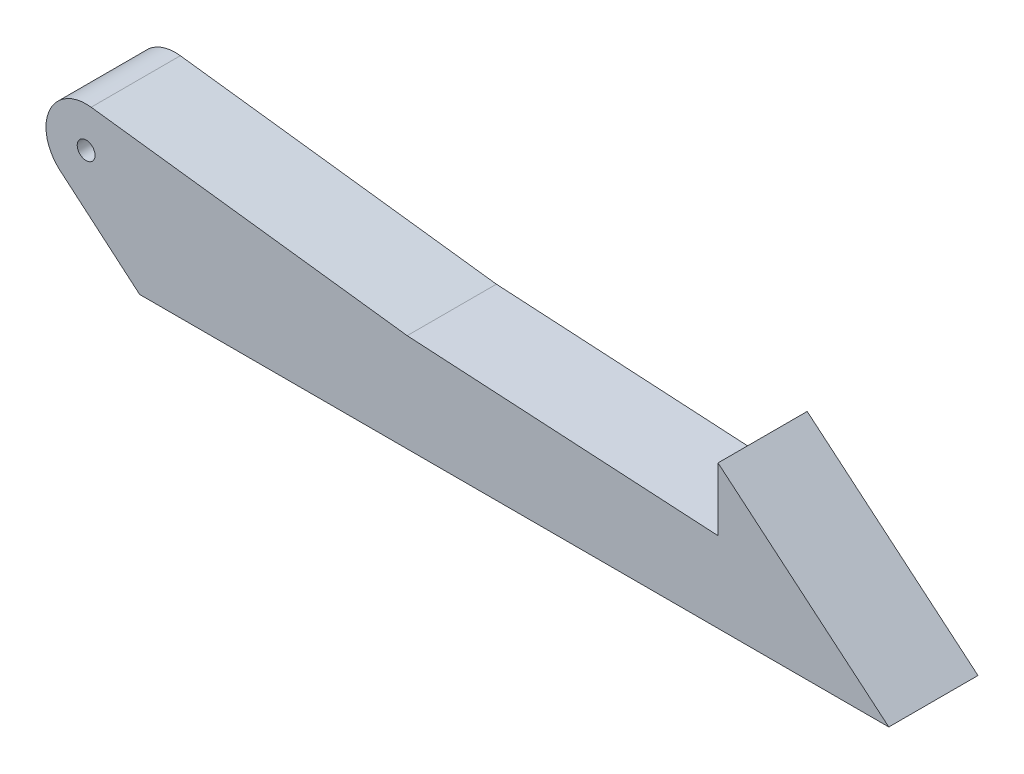
ISO-10303-21;
HEADER;
FILE_DESCRIPTION(('STEP AP214'),'2;1');
FILE_NAME('part.step','',(''),(''),'','','');
FILE_SCHEMA(('AUTOMOTIVE_DESIGN { 1 0 10303 214 1 1 1 1 }'));
ENDSEC;
DATA;
#1=APPLICATION_CONTEXT('core data for automotive mechanical design processes');
#2=APPLICATION_PROTOCOL_DEFINITION('international standard','automotive_design',2000,#1);
#3=PRODUCT_CONTEXT('',#1,'mechanical');
#4=PRODUCT('Part','Part','',(#3));
#5=PRODUCT_RELATED_PRODUCT_CATEGORY('part','',(#4));
#6=PRODUCT_DEFINITION_FORMATION('','',#4);
#7=PRODUCT_DEFINITION_CONTEXT('part definition',#1,'design');
#8=PRODUCT_DEFINITION('design','',#6,#7);
#9=PRODUCT_DEFINITION_SHAPE('','',#8);
#10=(LENGTH_UNIT() NAMED_UNIT(*) SI_UNIT(.MILLI.,.METRE.));
#11=(NAMED_UNIT(*) PLANE_ANGLE_UNIT() SI_UNIT($,.RADIAN.));
#12=(NAMED_UNIT(*) SI_UNIT($,.STERADIAN.) SOLID_ANGLE_UNIT());
#13=UNCERTAINTY_MEASURE_WITH_UNIT(LENGTH_MEASURE(1.E-05),#10,'distance_accuracy_value','');
#14=(GEOMETRIC_REPRESENTATION_CONTEXT(3) GLOBAL_UNCERTAINTY_ASSIGNED_CONTEXT((#13)) GLOBAL_UNIT_ASSIGNED_CONTEXT((#10,
#11,#12)) REPRESENTATION_CONTEXT('',''));
#15=CARTESIAN_POINT('',(0.,0.,0.));
#16=DIRECTION('',(0.,0.,1.));
#17=DIRECTION('',(1.,0.,0.));
#18=AXIS2_PLACEMENT_3D('',#15,#16,#17);
#19=CARTESIAN_POINT('',(0.5625,4.4647053374215,10.));
#20=DIRECTION('',(0.125,0.992156741649222,0.));
#21=DIRECTION('',(-0.992156741649222,0.125,0.));
#22=AXIS2_PLACEMENT_3D('',#19,#20,#21);
#23=PLANE('',#22);
#24=DIRECTION('',(0.992156741649222,-0.125,0.));
#25=VECTOR('',#24,1.);
#26=CARTESIAN_POINT('',(0.5625,4.4647053374215,0.));
#27=LINE('',#26,#25);
#28=CARTESIAN_POINT('',(0.562499999999999,4.4647053374215,0.));
#29=VERTEX_POINT('',#28);
#30=CARTESIAN_POINT('',(36.,0.,0.));
#31=VERTEX_POINT('',#30);
#32=EDGE_CURVE('E145',#29,#31,#27,.T.);
#33=ORIENTED_EDGE('',*,*,#32,.F.);
#34=DIRECTION('',(0.,0.,-1.));
#35=VECTOR('',#34,1.);
#36=CARTESIAN_POINT('',(0.562499999999999,4.4647053374215,10.));
#37=LINE('',#36,#35);
#38=CARTESIAN_POINT('',(0.562499999999999,4.4647053374215,10.));
#39=VERTEX_POINT('',#38);
#40=EDGE_CURVE('E11',#39,#29,#37,.T.);
#41=ORIENTED_EDGE('',*,*,#40,.F.);
#42=DIRECTION('',(0.992156741649222,-0.125,0.));
#43=VECTOR('',#42,1.);
#44=CARTESIAN_POINT('',(0.5625,4.4647053374215,10.));
#45=LINE('',#44,#43);
#46=CARTESIAN_POINT('',(36.,0.,10.));
#47=VERTEX_POINT('',#46);
#48=EDGE_CURVE('E198',#39,#47,#45,.T.);
#49=ORIENTED_EDGE('',*,*,#48,.T.);
#50=DIRECTION('',(0.,0.,-1.));
#51=VECTOR('',#50,1.);
#52=CARTESIAN_POINT('',(36.,0.,10.));
#53=LINE('',#52,#51);
#54=EDGE_CURVE('E65',#47,#31,#53,.T.);
#55=ORIENTED_EDGE('',*,*,#54,.T.);
#56=EDGE_LOOP('',(#33,#41,#49,#55));
#57=FACE_BOUND('',#56,.T.);
#58=ADVANCED_FACE('F47',(#57),#23,.T.);
#59=CARTESIAN_POINT('',(0.,0.,10.));
#60=DIRECTION('',(0.,0.,-1.));
#61=DIRECTION('',(-1.,0.,0.));
#62=AXIS2_PLACEMENT_3D('',#59,#60,#61);
#63=CYLINDRICAL_SURFACE('',#62,4.5);
#64=CARTESIAN_POINT('',(0.,0.,0.));
#65=DIRECTION('',(0.,0.,1.));
#66=DIRECTION('',(1.,0.,0.));
#67=AXIS2_PLACEMENT_3D('',#64,#65,#66);
#68=CIRCLE('',#67,4.5);
#69=CARTESIAN_POINT('',(-2.91308134009275,-3.4298625491415,0.));
#70=VERTEX_POINT('',#69);
#71=EDGE_CURVE('E148',#29,#70,#68,.T.);
#72=ORIENTED_EDGE('',*,*,#71,.T.);
#73=DIRECTION('',(0.,0.,-1.));
#74=VECTOR('',#73,1.);
#75=CARTESIAN_POINT('',(-2.91308134009275,-3.4298625491415,10.));
#76=LINE('',#75,#74);
#77=CARTESIAN_POINT('',(-2.91308134009275,-3.4298625491415,10.));
#78=VERTEX_POINT('',#77);
#79=EDGE_CURVE('E57',#78,#70,#76,.T.);
#80=ORIENTED_EDGE('',*,*,#79,.F.);
#81=CARTESIAN_POINT('',(0.,0.,10.));
#82=DIRECTION('',(0.,0.,1.));
#83=DIRECTION('',(1.,0.,0.));
#84=AXIS2_PLACEMENT_3D('',#81,#82,#83);
#85=CIRCLE('',#84,4.5);
#86=EDGE_CURVE('E193',#39,#78,#85,.T.);
#87=ORIENTED_EDGE('',*,*,#86,.F.);
#88=ORIENTED_EDGE('',*,*,#40,.T.);
#89=EDGE_LOOP('',(#72,#80,#87,#88));
#90=FACE_BOUND('',#89,.T.);
#91=ADVANCED_FACE('F187',(#90),#63,.T.);
#92=CARTESIAN_POINT('',(-2.91308134009275,-3.4298625491415,10.));
#93=DIRECTION('',(-0.6473514089095,-0.762191677587,0.));
#94=DIRECTION('',(0.762191677587,-0.6473514089095,0.));
#95=AXIS2_PLACEMENT_3D('',#92,#93,#94);
#96=PLANE('',#95);
#97=DIRECTION('',(-0.762191677587,0.6473514089095,0.));
#98=VECTOR('',#97,1.);
#99=CARTESIAN_POINT('',(-2.91308134009275,-3.4298625491415,0.));
#100=LINE('',#99,#98);
#101=CARTESIAN_POINT('',(6.,-11.,0.));
#102=VERTEX_POINT('',#101);
#103=EDGE_CURVE('E152',#102,#70,#100,.T.);
#104=ORIENTED_EDGE('',*,*,#103,.F.);
#105=DIRECTION('',(0.,0.,-1.));
#106=VECTOR('',#105,1.);
#107=CARTESIAN_POINT('',(6.,-11.,10.));
#108=LINE('',#107,#106);
#109=CARTESIAN_POINT('',(6.,-11.,10.));
#110=VERTEX_POINT('',#109);
#111=EDGE_CURVE('E176',#110,#102,#108,.T.);
#112=ORIENTED_EDGE('',*,*,#111,.F.);
#113=DIRECTION('',(-0.762191677587,0.6473514089095,0.));
#114=VECTOR('',#113,1.);
#115=CARTESIAN_POINT('',(-2.91308134009275,-3.4298625491415,10.));
#116=LINE('',#115,#114);
#117=EDGE_CURVE('E184',#110,#78,#116,.T.);
#118=ORIENTED_EDGE('',*,*,#117,.T.);
#119=ORIENTED_EDGE('',*,*,#79,.T.);
#120=EDGE_LOOP('',(#104,#112,#118,#119));
#121=FACE_BOUND('',#120,.T.);
#122=ADVANCED_FACE('F183',(#121),#96,.T.);
#123=CARTESIAN_POINT('',(0.,-11.,10.));
#124=DIRECTION('',(0.,-1.,0.));
#125=DIRECTION('',(0.,0.,-1.));
#126=AXIS2_PLACEMENT_3D('',#123,#124,#125);
#127=PLANE('',#126);
#128=DIRECTION('',(-1.,0.,0.));
#129=VECTOR('',#128,1.);
#130=CARTESIAN_POINT('',(0.,-11.,0.));
#131=LINE('',#130,#129);
#132=CARTESIAN_POINT('',(90.,-11.,0.));
#133=VERTEX_POINT('',#132);
#134=EDGE_CURVE('E156',#133,#102,#131,.T.);
#135=ORIENTED_EDGE('',*,*,#134,.F.);
#136=DIRECTION('',(0.,0.,-1.));
#137=VECTOR('',#136,1.);
#138=CARTESIAN_POINT('',(90.,-11.,10.));
#139=LINE('',#138,#137);
#140=CARTESIAN_POINT('',(90.,-11.,10.));
#141=VERTEX_POINT('',#140);
#142=EDGE_CURVE('E131',#141,#133,#139,.T.);
#143=ORIENTED_EDGE('',*,*,#142,.F.);
#144=DIRECTION('',(-1.,0.,0.));
#145=VECTOR('',#144,1.);
#146=CARTESIAN_POINT('',(0.,-11.,10.));
#147=LINE('',#146,#145);
#148=EDGE_CURVE('E119',#141,#110,#147,.T.);
#149=ORIENTED_EDGE('',*,*,#148,.T.);
#150=ORIENTED_EDGE('',*,*,#111,.T.);
#151=EDGE_LOOP('',(#135,#143,#149,#150));
#152=FACE_BOUND('',#151,.T.);
#153=ADVANCED_FACE('F192',(#152),#127,.T.);
#154=CARTESIAN_POINT('',(31.7693893634211,37.8612839083813,10.));
#155=DIRECTION('',(-0.64278760968654,-0.766044443118977,0.));
#156=DIRECTION('',(0.766044443118977,-0.64278760968654,0.));
#157=AXIS2_PLACEMENT_3D('',#154,#155,#156);
#158=PLANE('',#157);
#159=DIRECTION('',(-0.766044443118977,0.64278760968654,0.));
#160=VECTOR('',#159,1.);
#161=CARTESIAN_POINT('',(31.7693893634211,37.8612839083813,0.));
#162=LINE('',#161,#160);
#163=CARTESIAN_POINT('',(70.8488889220256,5.0696902421635,0.));
#164=VERTEX_POINT('',#163);
#165=EDGE_CURVE('E127',#133,#164,#162,.T.);
#166=ORIENTED_EDGE('',*,*,#165,.T.);
#167=DIRECTION('',(0.,0.,-1.));
#168=VECTOR('',#167,1.);
#169=CARTESIAN_POINT('',(70.8488889220256,5.0696902421635,10.));
#170=LINE('',#169,#168);
#171=CARTESIAN_POINT('',(70.8488889220256,5.0696902421635,10.));
#172=VERTEX_POINT('',#171);
#173=EDGE_CURVE('E124',#172,#164,#170,.T.);
#174=ORIENTED_EDGE('',*,*,#173,.F.);
#175=DIRECTION('',(-0.766044443118977,0.64278760968654,0.));
#176=VECTOR('',#175,1.);
#177=CARTESIAN_POINT('',(31.7693893634211,37.8612839083813,10.));
#178=LINE('',#177,#176);
#179=EDGE_CURVE('E110',#141,#172,#178,.T.);
#180=ORIENTED_EDGE('',*,*,#179,.F.);
#181=ORIENTED_EDGE('',*,*,#142,.T.);
#182=EDGE_LOOP('',(#166,#174,#180,#181));
#183=FACE_BOUND('',#182,.T.);
#184=ADVANCED_FACE('F125',(#183),#158,.F.);
#185=CARTESIAN_POINT('',(70.8488889220256,0.,10.));
#186=DIRECTION('',(-1.,0.,0.));
#187=DIRECTION('',(0.,0.,1.));
#188=AXIS2_PLACEMENT_3D('',#185,#186,#187);
#189=PLANE('',#188);
#190=DIRECTION('',(0.,1.,0.));
#191=VECTOR('',#190,1.);
#192=CARTESIAN_POINT('',(70.8488889220256,0.,0.));
#193=LINE('',#192,#191);
#194=CARTESIAN_POINT('',(70.8488889220256,-2.,0.));
#195=VERTEX_POINT('',#194);
#196=EDGE_CURVE('E162',#195,#164,#193,.T.);
#197=ORIENTED_EDGE('',*,*,#196,.F.);
#198=DIRECTION('',(0.,0.,-1.));
#199=VECTOR('',#198,1.);
#200=CARTESIAN_POINT('',(70.8488889220256,-2.,10.));
#201=LINE('',#200,#199);
#202=CARTESIAN_POINT('',(70.8488889220256,-2.,10.));
#203=VERTEX_POINT('',#202);
#204=EDGE_CURVE('E87',#203,#195,#201,.T.);
#205=ORIENTED_EDGE('',*,*,#204,.F.);
#206=DIRECTION('',(0.,1.,0.));
#207=VECTOR('',#206,1.);
#208=CARTESIAN_POINT('',(70.8488889220256,0.,10.));
#209=LINE('',#208,#207);
#210=EDGE_CURVE('E116',#203,#172,#209,.T.);
#211=ORIENTED_EDGE('',*,*,#210,.T.);
#212=ORIENTED_EDGE('',*,*,#173,.T.);
#213=EDGE_LOOP('',(#197,#205,#211,#212));
#214=FACE_BOUND('',#213,.T.);
#215=ADVANCED_FACE('F133',(#214),#189,.T.);
#216=CARTESIAN_POINT('',(0.,0.,10.));
#217=DIRECTION('',(0.,0.,-1.));
#218=DIRECTION('',(-1.,0.,0.));
#219=AXIS2_PLACEMENT_3D('',#216,#217,#218);
#220=CYLINDRICAL_SURFACE('',#219,0.999999999999999);
#221=CARTESIAN_POINT('',(0.,0.,10.));
#222=DIRECTION('',(0.,0.,1.));
#223=DIRECTION('',(1.,0.,0.));
#224=AXIS2_PLACEMENT_3D('',#221,#222,#223);
#225=CIRCLE('',#224,0.999999999999999);
#226=CARTESIAN_POINT('',(0.999999999999999,0.,10.));
#227=VERTEX_POINT('',#226);
#228=EDGE_CURVE('E169',#227,#227,#225,.T.);
#229=ORIENTED_EDGE('',*,*,#228,.T.);
#230=EDGE_LOOP('',(#229));
#231=FACE_BOUND('',#230,.T.);
#232=CARTESIAN_POINT('',(0.,0.,0.));
#233=DIRECTION('',(0.,0.,1.));
#234=DIRECTION('',(1.,0.,0.));
#235=AXIS2_PLACEMENT_3D('',#232,#233,#234);
#236=CIRCLE('',#235,0.999999999999999);
#237=CARTESIAN_POINT('',(0.999999999999999,0.,0.));
#238=VERTEX_POINT('',#237);
#239=EDGE_CURVE('E141',#238,#238,#236,.T.);
#240=ORIENTED_EDGE('',*,*,#239,.F.);
#241=EDGE_LOOP('',(#240));
#242=FACE_BOUND('',#241,.T.);
#243=ADVANCED_FACE('F49',(#231,#242),#220,.F.);
#244=CARTESIAN_POINT('',(0.118183416580476,2.05928037841925,10.));
#245=DIRECTION('',(0.0572963583728583,0.998357214286154,0.));
#246=DIRECTION('',(-0.998357214286154,0.0572963583728583,0.));
#247=AXIS2_PLACEMENT_3D('',#244,#245,#246);
#248=PLANE('',#247);
#249=DIRECTION('',(0.998357214286154,-0.0572963583728583,0.));
#250=VECTOR('',#249,1.);
#251=CARTESIAN_POINT('',(0.118183416580476,2.05928037841925,0.));
#252=LINE('',#251,#250);
#253=EDGE_CURVE('E165',#31,#195,#252,.T.);
#254=ORIENTED_EDGE('',*,*,#253,.F.);
#255=ORIENTED_EDGE('',*,*,#54,.F.);
#256=DIRECTION('',(0.998357214286154,-0.0572963583728583,0.));
#257=VECTOR('',#256,1.);
#258=CARTESIAN_POINT('',(0.118183416580476,2.05928037841925,10.));
#259=LINE('',#258,#257);
#260=EDGE_CURVE('E135',#47,#203,#259,.T.);
#261=ORIENTED_EDGE('',*,*,#260,.T.);
#262=ORIENTED_EDGE('',*,*,#204,.T.);
#263=EDGE_LOOP('',(#254,#255,#261,#262));
#264=FACE_BOUND('',#263,.T.);
#265=ADVANCED_FACE('F210',(#264),#248,.T.);
#266=CARTESIAN_POINT('',(0.,0.,10.));
#267=DIRECTION('',(0.,0.,1.));
#268=DIRECTION('',(1.,0.,0.));
#269=AXIS2_PLACEMENT_3D('',#266,#267,#268);
#270=PLANE('',#269);
#271=ORIENTED_EDGE('',*,*,#228,.F.);
#272=EDGE_LOOP('',(#271));
#273=FACE_BOUND('',#272,.T.);
#274=ORIENTED_EDGE('',*,*,#48,.F.);
#275=ORIENTED_EDGE('',*,*,#86,.T.);
#276=ORIENTED_EDGE('',*,*,#117,.F.);
#277=ORIENTED_EDGE('',*,*,#148,.F.);
#278=ORIENTED_EDGE('',*,*,#179,.T.);
#279=ORIENTED_EDGE('',*,*,#210,.F.);
#280=ORIENTED_EDGE('',*,*,#260,.F.);
#281=EDGE_LOOP('',(#274,#275,#276,#277,#278,#279,#280));
#282=FACE_BOUND('',#281,.T.);
#283=ADVANCED_FACE('F113',(#273,#282),#270,.T.);
#284=CARTESIAN_POINT('',(0.,0.,0.));
#285=DIRECTION('',(0.,0.,1.));
#286=DIRECTION('',(1.,0.,0.));
#287=AXIS2_PLACEMENT_3D('',#284,#285,#286);
#288=PLANE('',#287);
#289=ORIENTED_EDGE('',*,*,#239,.T.);
#290=EDGE_LOOP('',(#289));
#291=FACE_BOUND('',#290,.T.);
#292=ORIENTED_EDGE('',*,*,#32,.T.);
#293=ORIENTED_EDGE('',*,*,#253,.T.);
#294=ORIENTED_EDGE('',*,*,#196,.T.);
#295=ORIENTED_EDGE('',*,*,#165,.F.);
#296=ORIENTED_EDGE('',*,*,#134,.T.);
#297=ORIENTED_EDGE('',*,*,#103,.T.);
#298=ORIENTED_EDGE('',*,*,#71,.F.);
#299=EDGE_LOOP('',(#292,#293,#294,#295,#296,#297,#298));
#300=FACE_BOUND('',#299,.T.);
#301=ADVANCED_FACE('F189',(#291,#300),#288,.F.);
#302=CLOSED_SHELL('',(#58,#91,#122,#153,#184,#215,#243,#265,#283,#301));
#303=MANIFOLD_SOLID_BREP('B2',#302);
#304=ADVANCED_BREP_SHAPE_REPRESENTATION('',(#18,#303),#14);
#305=SHAPE_DEFINITION_REPRESENTATION(#9,#304);
ENDSEC;
END-ISO-10303-21;
